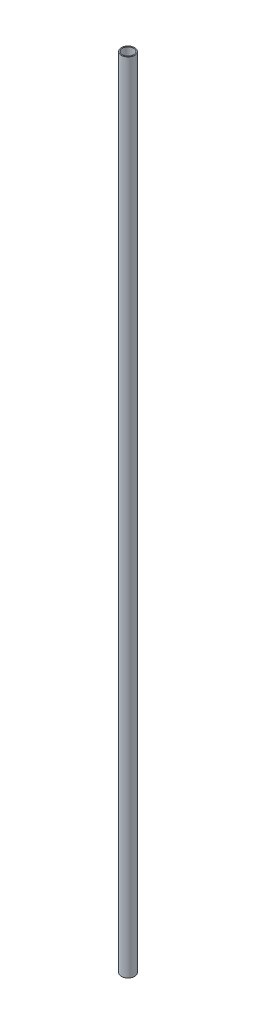
ISO-10303-21;
HEADER;
FILE_DESCRIPTION(('STEP AP214'),'2;1');
FILE_NAME('part.step','',(''),(''),'','','');
FILE_SCHEMA(('AUTOMOTIVE_DESIGN { 1 0 10303 214 1 1 1 1 }'));
ENDSEC;
DATA;
#1=APPLICATION_CONTEXT('core data for automotive mechanical design processes');
#2=APPLICATION_PROTOCOL_DEFINITION('international standard','automotive_design',2000,#1);
#3=PRODUCT_CONTEXT('',#1,'mechanical');
#4=PRODUCT('Part','Part','',(#3));
#5=PRODUCT_RELATED_PRODUCT_CATEGORY('part','',(#4));
#6=PRODUCT_DEFINITION_FORMATION('','',#4);
#7=PRODUCT_DEFINITION_CONTEXT('part definition',#1,'design');
#8=PRODUCT_DEFINITION('design','',#6,#7);
#9=PRODUCT_DEFINITION_SHAPE('','',#8);
#10=(LENGTH_UNIT() NAMED_UNIT(*) SI_UNIT(.MILLI.,.METRE.));
#11=(NAMED_UNIT(*) PLANE_ANGLE_UNIT() SI_UNIT($,.RADIAN.));
#12=(NAMED_UNIT(*) SI_UNIT($,.STERADIAN.) SOLID_ANGLE_UNIT());
#13=UNCERTAINTY_MEASURE_WITH_UNIT(LENGTH_MEASURE(1.E-05),#10,'distance_accuracy_value','');
#14=(GEOMETRIC_REPRESENTATION_CONTEXT(3) GLOBAL_UNCERTAINTY_ASSIGNED_CONTEXT((#13)) GLOBAL_UNIT_ASSIGNED_CONTEXT((#10,
#11,#12)) REPRESENTATION_CONTEXT('',''));
#15=CARTESIAN_POINT('',(0.,0.,0.));
#16=DIRECTION('',(0.,0.,1.));
#17=DIRECTION('',(1.,0.,0.));
#18=AXIS2_PLACEMENT_3D('',#15,#16,#17);
#19=CARTESIAN_POINT('',(0.,770.,0.));
#20=DIRECTION('',(0.,1.,0.));
#21=DIRECTION('',(0.,0.,1.));
#22=AXIS2_PLACEMENT_3D('',#19,#20,#21);
#23=PLANE('',#22);
#24=CARTESIAN_POINT('',(0.,770.,0.));
#25=DIRECTION('',(0.,1.,0.));
#26=DIRECTION('',(0.,0.,1.));
#27=AXIS2_PLACEMENT_3D('',#24,#25,#26);
#28=CIRCLE('',#27,6.45);
#29=CARTESIAN_POINT('',(0.,770.,6.45));
#30=VERTEX_POINT('',#29);
#31=EDGE_CURVE('E10',#30,#30,#28,.T.);
#32=ORIENTED_EDGE('',*,*,#31,.T.);
#33=EDGE_LOOP('',(#32));
#34=FACE_BOUND('',#33,.T.);
#35=CARTESIAN_POINT('',(0.,770.,0.));
#36=DIRECTION('',(0.,1.,0.));
#37=DIRECTION('',(0.,0.,1.));
#38=AXIS2_PLACEMENT_3D('',#35,#36,#37);
#39=CIRCLE('',#38,5.45);
#40=CARTESIAN_POINT('',(0.,770.,5.45));
#41=VERTEX_POINT('',#40);
#42=EDGE_CURVE('E52',#41,#41,#39,.T.);
#43=ORIENTED_EDGE('',*,*,#42,.F.);
#44=EDGE_LOOP('',(#43));
#45=FACE_BOUND('',#44,.T.);
#46=ADVANCED_FACE('F39',(#34,#45),#23,.T.);
#47=CARTESIAN_POINT('',(0.,0.,0.));
#48=DIRECTION('',(0.,1.,0.));
#49=DIRECTION('',(0.,0.,1.));
#50=AXIS2_PLACEMENT_3D('',#47,#48,#49);
#51=PLANE('',#50);
#52=CARTESIAN_POINT('',(0.,0.,0.));
#53=DIRECTION('',(0.,1.,0.));
#54=DIRECTION('',(0.,0.,1.));
#55=AXIS2_PLACEMENT_3D('',#52,#53,#54);
#56=CIRCLE('',#55,6.45);
#57=CARTESIAN_POINT('',(0.,0.,6.45));
#58=VERTEX_POINT('',#57);
#59=EDGE_CURVE('E43',#58,#58,#56,.T.);
#60=ORIENTED_EDGE('',*,*,#59,.F.);
#61=EDGE_LOOP('',(#60));
#62=FACE_BOUND('',#61,.T.);
#63=CARTESIAN_POINT('',(0.,0.,0.));
#64=DIRECTION('',(0.,1.,0.));
#65=DIRECTION('',(0.,0.,1.));
#66=AXIS2_PLACEMENT_3D('',#63,#64,#65);
#67=CIRCLE('',#66,5.45);
#68=CARTESIAN_POINT('',(0.,0.,5.45));
#69=VERTEX_POINT('',#68);
#70=EDGE_CURVE('E54',#69,#69,#67,.T.);
#71=ORIENTED_EDGE('',*,*,#70,.T.);
#72=EDGE_LOOP('',(#71));
#73=FACE_BOUND('',#72,.T.);
#74=ADVANCED_FACE('F66',(#62,#73),#51,.F.);
#75=CARTESIAN_POINT('',(0.,770.,0.));
#76=DIRECTION('',(0.,-1.,0.));
#77=DIRECTION('',(0.,0.,-1.));
#78=AXIS2_PLACEMENT_3D('',#75,#76,#77);
#79=CYLINDRICAL_SURFACE('',#78,6.45);
#80=ORIENTED_EDGE('',*,*,#31,.F.);
#81=EDGE_LOOP('',(#80));
#82=FACE_BOUND('',#81,.T.);
#83=ORIENTED_EDGE('',*,*,#59,.T.);
#84=EDGE_LOOP('',(#83));
#85=FACE_BOUND('',#84,.T.);
#86=ADVANCED_FACE('F41',(#82,#85),#79,.T.);
#87=CARTESIAN_POINT('',(0.,770.,0.));
#88=DIRECTION('',(0.,-1.,0.));
#89=DIRECTION('',(0.,0.,-1.));
#90=AXIS2_PLACEMENT_3D('',#87,#88,#89);
#91=CYLINDRICAL_SURFACE('',#90,5.45);
#92=ORIENTED_EDGE('',*,*,#42,.T.);
#93=EDGE_LOOP('',(#92));
#94=FACE_BOUND('',#93,.T.);
#95=ORIENTED_EDGE('',*,*,#70,.F.);
#96=EDGE_LOOP('',(#95));
#97=FACE_BOUND('',#96,.T.);
#98=ADVANCED_FACE('F62',(#94,#97),#91,.F.);
#99=CLOSED_SHELL('',(#46,#74,#86,#98));
#100=MANIFOLD_SOLID_BREP('B2',#99);
#101=ADVANCED_BREP_SHAPE_REPRESENTATION('',(#18,#100),#14);
#102=SHAPE_DEFINITION_REPRESENTATION(#9,#101);
ENDSEC;
END-ISO-10303-21;
